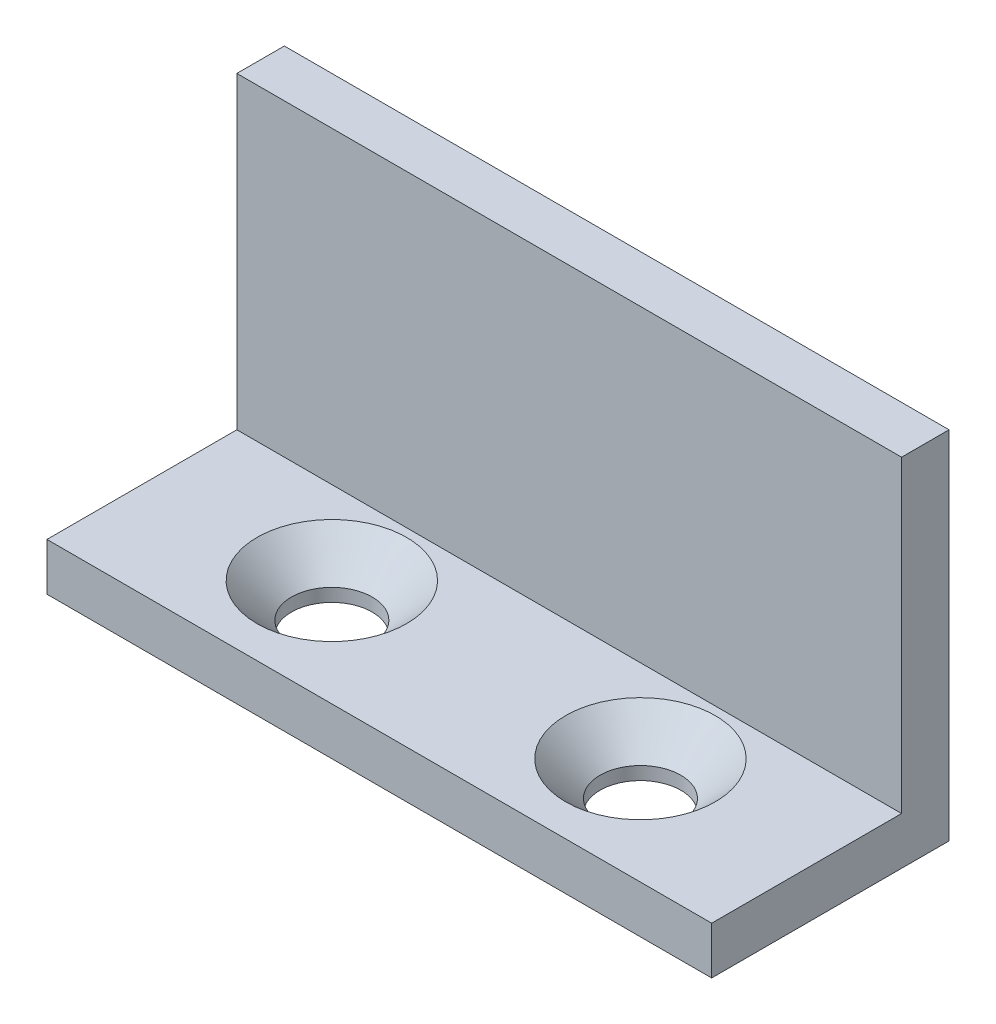
ISO-10303-21;
HEADER;
FILE_DESCRIPTION(('STEP AP214'),'2;1');
FILE_NAME('part.step','',(''),(''),'','','');
FILE_SCHEMA(('AUTOMOTIVE_DESIGN { 1 0 10303 214 1 1 1 1 }'));
ENDSEC;
DATA;
#1=APPLICATION_CONTEXT('core data for automotive mechanical design processes');
#2=APPLICATION_PROTOCOL_DEFINITION('international standard','automotive_design',2000,#1);
#3=PRODUCT_CONTEXT('',#1,'mechanical');
#4=PRODUCT('Part','Part','',(#3));
#5=PRODUCT_RELATED_PRODUCT_CATEGORY('part','',(#4));
#6=PRODUCT_DEFINITION_FORMATION('','',#4);
#7=PRODUCT_DEFINITION_CONTEXT('part definition',#1,'design');
#8=PRODUCT_DEFINITION('design','',#6,#7);
#9=PRODUCT_DEFINITION_SHAPE('','',#8);
#10=(LENGTH_UNIT() NAMED_UNIT(*) SI_UNIT(.MILLI.,.METRE.));
#11=(NAMED_UNIT(*) PLANE_ANGLE_UNIT() SI_UNIT($,.RADIAN.));
#12=(NAMED_UNIT(*) SI_UNIT($,.STERADIAN.) SOLID_ANGLE_UNIT());
#13=UNCERTAINTY_MEASURE_WITH_UNIT(LENGTH_MEASURE(1.E-05),#10,'distance_accuracy_value','');
#14=(GEOMETRIC_REPRESENTATION_CONTEXT(3) GLOBAL_UNCERTAINTY_ASSIGNED_CONTEXT((#13)) GLOBAL_UNIT_ASSIGNED_CONTEXT((#10,
#11,#12)) REPRESENTATION_CONTEXT('',''));
#15=CARTESIAN_POINT('',(0.,0.,0.));
#16=DIRECTION('',(0.,0.,1.));
#17=DIRECTION('',(1.,0.,0.));
#18=AXIS2_PLACEMENT_3D('',#15,#16,#17);
#19=CARTESIAN_POINT('',(28.,2.,10.));
#20=DIRECTION('',(0.,0.,-1.));
#21=DIRECTION('',(-1.,0.,0.));
#22=AXIS2_PLACEMENT_3D('',#19,#20,#21);
#23=PLANE('',#22);
#24=DIRECTION('',(0.,-1.,0.));
#25=VECTOR('',#24,1.);
#26=CARTESIAN_POINT('',(0.,2.,10.));
#27=LINE('',#26,#25);
#28=CARTESIAN_POINT('',(0.,2.,10.));
#29=VERTEX_POINT('',#28);
#30=CARTESIAN_POINT('',(0.,0.,10.));
#31=VERTEX_POINT('',#30);
#32=EDGE_CURVE('E120',#29,#31,#27,.T.);
#33=ORIENTED_EDGE('',*,*,#32,.T.);
#34=DIRECTION('',(-1.,0.,0.));
#35=VECTOR('',#34,1.);
#36=CARTESIAN_POINT('',(28.,0.,10.));
#37=LINE('',#36,#35);
#38=CARTESIAN_POINT('',(28.,0.,10.));
#39=VERTEX_POINT('',#38);
#40=EDGE_CURVE('E11',#39,#31,#37,.T.);
#41=ORIENTED_EDGE('',*,*,#40,.F.);
#42=DIRECTION('',(0.,-1.,0.));
#43=VECTOR('',#42,1.);
#44=CARTESIAN_POINT('',(28.,2.,10.));
#45=LINE('',#44,#43);
#46=CARTESIAN_POINT('',(28.,2.,10.));
#47=VERTEX_POINT('',#46);
#48=EDGE_CURVE('E131',#47,#39,#45,.T.);
#49=ORIENTED_EDGE('',*,*,#48,.F.);
#50=DIRECTION('',(-1.,0.,0.));
#51=VECTOR('',#50,1.);
#52=CARTESIAN_POINT('',(28.,2.,10.));
#53=LINE('',#52,#51);
#54=EDGE_CURVE('E116',#47,#29,#53,.T.);
#55=ORIENTED_EDGE('',*,*,#54,.T.);
#56=EDGE_LOOP('',(#33,#41,#49,#55));
#57=FACE_BOUND('',#56,.T.);
#58=ADVANCED_FACE('F36',(#57),#23,.F.);
#59=CARTESIAN_POINT('',(28.,0.,10.));
#60=DIRECTION('',(0.,1.,0.));
#61=DIRECTION('',(0.,0.,1.));
#62=AXIS2_PLACEMENT_3D('',#59,#60,#61);
#63=PLANE('',#62);
#64=CARTESIAN_POINT('',(7.5,0.,5.5));
#65=DIRECTION('',(0.,1.,0.));
#66=DIRECTION('',(0.,0.,1.));
#67=AXIS2_PLACEMENT_3D('',#64,#65,#66);
#68=CIRCLE('',#67,1.7);
#69=CARTESIAN_POINT('',(7.5,0.,7.2));
#70=VERTEX_POINT('',#69);
#71=EDGE_CURVE('E253',#70,#70,#68,.T.);
#72=ORIENTED_EDGE('',*,*,#71,.T.);
#73=EDGE_LOOP('',(#72));
#74=FACE_BOUND('',#73,.T.);
#75=CARTESIAN_POINT('',(20.5,0.,5.5));
#76=DIRECTION('',(0.,1.,0.));
#77=DIRECTION('',(0.,0.,1.));
#78=AXIS2_PLACEMENT_3D('',#75,#76,#77);
#79=CIRCLE('',#78,1.7);
#80=CARTESIAN_POINT('',(20.5,0.,7.2));
#81=VERTEX_POINT('',#80);
#82=EDGE_CURVE('E124',#81,#81,#79,.T.);
#83=ORIENTED_EDGE('',*,*,#82,.T.);
#84=EDGE_LOOP('',(#83));
#85=FACE_BOUND('',#84,.T.);
#86=DIRECTION('',(0.,0.,-1.));
#87=VECTOR('',#86,1.);
#88=CARTESIAN_POINT('',(0.,0.,10.));
#89=LINE('',#88,#87);
#90=CARTESIAN_POINT('',(0.,0.,0.));
#91=VERTEX_POINT('',#90);
#92=EDGE_CURVE('E123',#31,#91,#89,.T.);
#93=ORIENTED_EDGE('',*,*,#92,.T.);
#94=DIRECTION('',(-1.,0.,0.));
#95=VECTOR('',#94,1.);
#96=CARTESIAN_POINT('',(28.,0.,0.));
#97=LINE('',#96,#95);
#98=CARTESIAN_POINT('',(28.,0.,0.));
#99=VERTEX_POINT('',#98);
#100=EDGE_CURVE('E44',#99,#91,#97,.T.);
#101=ORIENTED_EDGE('',*,*,#100,.F.);
#102=DIRECTION('',(0.,0.,-1.));
#103=VECTOR('',#102,1.);
#104=CARTESIAN_POINT('',(28.,0.,10.));
#105=LINE('',#104,#103);
#106=EDGE_CURVE('E89',#39,#99,#105,.T.);
#107=ORIENTED_EDGE('',*,*,#106,.F.);
#108=ORIENTED_EDGE('',*,*,#40,.T.);
#109=EDGE_LOOP('',(#93,#101,#107,#108));
#110=FACE_BOUND('',#109,.T.);
#111=ADVANCED_FACE('F158',(#74,#85,#110),#63,.F.);
#112=CARTESIAN_POINT('',(28.,0.,0.));
#113=DIRECTION('',(0.,0.,1.));
#114=DIRECTION('',(1.,0.,0.));
#115=AXIS2_PLACEMENT_3D('',#112,#113,#114);
#116=PLANE('',#115);
#117=DIRECTION('',(0.,1.,0.));
#118=VECTOR('',#117,1.);
#119=CARTESIAN_POINT('',(0.,0.,0.));
#120=LINE('',#119,#118);
#121=CARTESIAN_POINT('',(0.,15.,0.));
#122=VERTEX_POINT('',#121);
#123=EDGE_CURVE('E126',#91,#122,#120,.T.);
#124=ORIENTED_EDGE('',*,*,#123,.T.);
#125=DIRECTION('',(-1.,0.,0.));
#126=VECTOR('',#125,1.);
#127=CARTESIAN_POINT('',(28.,15.,0.));
#128=LINE('',#127,#126);
#129=CARTESIAN_POINT('',(28.,15.,0.));
#130=VERTEX_POINT('',#129);
#131=EDGE_CURVE('E111',#130,#122,#128,.T.);
#132=ORIENTED_EDGE('',*,*,#131,.F.);
#133=DIRECTION('',(0.,1.,0.));
#134=VECTOR('',#133,1.);
#135=CARTESIAN_POINT('',(28.,0.,0.));
#136=LINE('',#135,#134);
#137=EDGE_CURVE('E102',#99,#130,#136,.T.);
#138=ORIENTED_EDGE('',*,*,#137,.F.);
#139=ORIENTED_EDGE('',*,*,#100,.T.);
#140=EDGE_LOOP('',(#124,#132,#138,#139));
#141=FACE_BOUND('',#140,.T.);
#142=ADVANCED_FACE('F137',(#141),#116,.F.);
#143=CARTESIAN_POINT('',(28.,15.,2.));
#144=DIRECTION('',(0.,-1.,0.));
#145=DIRECTION('',(0.,0.,-1.));
#146=AXIS2_PLACEMENT_3D('',#143,#144,#145);
#147=PLANE('',#146);
#148=DIRECTION('',(0.,0.,1.));
#149=VECTOR('',#148,1.);
#150=CARTESIAN_POINT('',(0.,15.,2.));
#151=LINE('',#150,#149);
#152=CARTESIAN_POINT('',(0.,15.,2.));
#153=VERTEX_POINT('',#152);
#154=EDGE_CURVE('E110',#122,#153,#151,.T.);
#155=ORIENTED_EDGE('',*,*,#154,.T.);
#156=DIRECTION('',(-1.,0.,0.));
#157=VECTOR('',#156,1.);
#158=CARTESIAN_POINT('',(28.,15.,2.));
#159=LINE('',#158,#157);
#160=CARTESIAN_POINT('',(28.,15.,2.));
#161=VERTEX_POINT('',#160);
#162=EDGE_CURVE('E107',#161,#153,#159,.T.);
#163=ORIENTED_EDGE('',*,*,#162,.F.);
#164=DIRECTION('',(0.,0.,1.));
#165=VECTOR('',#164,1.);
#166=CARTESIAN_POINT('',(28.,15.,2.));
#167=LINE('',#166,#165);
#168=EDGE_CURVE('E96',#130,#161,#167,.T.);
#169=ORIENTED_EDGE('',*,*,#168,.F.);
#170=ORIENTED_EDGE('',*,*,#131,.T.);
#171=EDGE_LOOP('',(#155,#163,#169,#170));
#172=FACE_BOUND('',#171,.T.);
#173=ADVANCED_FACE('F108',(#172),#147,.F.);
#174=CARTESIAN_POINT('',(28.,2.,2.));
#175=DIRECTION('',(0.,0.,-1.));
#176=DIRECTION('',(-1.,0.,0.));
#177=AXIS2_PLACEMENT_3D('',#174,#175,#176);
#178=PLANE('',#177);
#179=DIRECTION('',(0.,-1.,0.));
#180=VECTOR('',#179,1.);
#181=CARTESIAN_POINT('',(0.,2.,2.));
#182=LINE('',#181,#180);
#183=CARTESIAN_POINT('',(0.,2.,2.));
#184=VERTEX_POINT('',#183);
#185=EDGE_CURVE('E75',#153,#184,#182,.T.);
#186=ORIENTED_EDGE('',*,*,#185,.T.);
#187=DIRECTION('',(-1.,0.,0.));
#188=VECTOR('',#187,1.);
#189=CARTESIAN_POINT('',(28.,2.,2.));
#190=LINE('',#189,#188);
#191=CARTESIAN_POINT('',(28.,2.,2.));
#192=VERTEX_POINT('',#191);
#193=EDGE_CURVE('E112',#192,#184,#190,.T.);
#194=ORIENTED_EDGE('',*,*,#193,.F.);
#195=DIRECTION('',(0.,-1.,0.));
#196=VECTOR('',#195,1.);
#197=CARTESIAN_POINT('',(28.,2.,2.));
#198=LINE('',#197,#196);
#199=EDGE_CURVE('E100',#161,#192,#198,.T.);
#200=ORIENTED_EDGE('',*,*,#199,.F.);
#201=ORIENTED_EDGE('',*,*,#162,.T.);
#202=EDGE_LOOP('',(#186,#194,#200,#201));
#203=FACE_BOUND('',#202,.T.);
#204=ADVANCED_FACE('F114',(#203),#178,.F.);
#205=CARTESIAN_POINT('',(28.,2.,10.));
#206=DIRECTION('',(0.,-1.,0.));
#207=DIRECTION('',(0.,0.,-1.));
#208=AXIS2_PLACEMENT_3D('',#205,#206,#207);
#209=PLANE('',#208);
#210=CARTESIAN_POINT('',(7.5,2.,5.5));
#211=DIRECTION('',(0.,1.,0.));
#212=DIRECTION('',(0.,0.,1.));
#213=AXIS2_PLACEMENT_3D('',#210,#211,#212);
#214=CIRCLE('',#213,3.15);
#215=CARTESIAN_POINT('',(7.5,2.,8.65));
#216=VERTEX_POINT('',#215);
#217=EDGE_CURVE('E251',#216,#216,#214,.T.);
#218=ORIENTED_EDGE('',*,*,#217,.F.);
#219=EDGE_LOOP('',(#218));
#220=FACE_BOUND('',#219,.T.);
#221=CARTESIAN_POINT('',(20.5,2.,5.5));
#222=DIRECTION('',(0.,1.,0.));
#223=DIRECTION('',(0.,0.,1.));
#224=AXIS2_PLACEMENT_3D('',#221,#222,#223);
#225=CIRCLE('',#224,3.15);
#226=CARTESIAN_POINT('',(20.5,2.,8.65));
#227=VERTEX_POINT('',#226);
#228=EDGE_CURVE('E257',#227,#227,#225,.T.);
#229=ORIENTED_EDGE('',*,*,#228,.F.);
#230=EDGE_LOOP('',(#229));
#231=FACE_BOUND('',#230,.T.);
#232=DIRECTION('',(0.,0.,1.));
#233=VECTOR('',#232,1.);
#234=CARTESIAN_POINT('',(0.,2.,10.));
#235=LINE('',#234,#233);
#236=EDGE_CURVE('E81',#184,#29,#235,.T.);
#237=ORIENTED_EDGE('',*,*,#236,.T.);
#238=ORIENTED_EDGE('',*,*,#54,.F.);
#239=DIRECTION('',(0.,0.,1.));
#240=VECTOR('',#239,1.);
#241=CARTESIAN_POINT('',(28.,2.,10.));
#242=LINE('',#241,#240);
#243=EDGE_CURVE('E52',#192,#47,#242,.T.);
#244=ORIENTED_EDGE('',*,*,#243,.F.);
#245=ORIENTED_EDGE('',*,*,#193,.T.);
#246=EDGE_LOOP('',(#237,#238,#244,#245));
#247=FACE_BOUND('',#246,.T.);
#248=ADVANCED_FACE('F144',(#220,#231,#247),#209,.F.);
#249=CARTESIAN_POINT('',(28.,0.,0.));
#250=DIRECTION('',(1.,0.,0.));
#251=DIRECTION('',(0.,0.,-1.));
#252=AXIS2_PLACEMENT_3D('',#249,#250,#251);
#253=PLANE('',#252);
#254=ORIENTED_EDGE('',*,*,#48,.T.);
#255=ORIENTED_EDGE('',*,*,#106,.T.);
#256=ORIENTED_EDGE('',*,*,#137,.T.);
#257=ORIENTED_EDGE('',*,*,#168,.T.);
#258=ORIENTED_EDGE('',*,*,#199,.T.);
#259=ORIENTED_EDGE('',*,*,#243,.T.);
#260=EDGE_LOOP('',(#254,#255,#256,#257,#258,#259));
#261=FACE_BOUND('',#260,.T.);
#262=ADVANCED_FACE('F98',(#261),#253,.T.);
#263=CARTESIAN_POINT('',(0.,0.,0.));
#264=DIRECTION('',(1.,0.,0.));
#265=DIRECTION('',(0.,0.,-1.));
#266=AXIS2_PLACEMENT_3D('',#263,#264,#265);
#267=PLANE('',#266);
#268=ORIENTED_EDGE('',*,*,#32,.F.);
#269=ORIENTED_EDGE('',*,*,#236,.F.);
#270=ORIENTED_EDGE('',*,*,#185,.F.);
#271=ORIENTED_EDGE('',*,*,#154,.F.);
#272=ORIENTED_EDGE('',*,*,#123,.F.);
#273=ORIENTED_EDGE('',*,*,#92,.F.);
#274=EDGE_LOOP('',(#268,#269,#270,#271,#272,#273));
#275=FACE_BOUND('',#274,.T.);
#276=ADVANCED_FACE('F140',(#275),#267,.F.);
#277=CARTESIAN_POINT('',(20.5,2.,5.5));
#278=DIRECTION('',(0.,1.,0.));
#279=DIRECTION('',(0.,0.,1.));
#280=AXIS2_PLACEMENT_3D('',#277,#278,#279);
#281=CYLINDRICAL_SURFACE('',#280,1.69999999999999);
#282=ORIENTED_EDGE('',*,*,#82,.F.);
#283=EDGE_LOOP('',(#282));
#284=FACE_BOUND('',#283,.T.);
#285=CARTESIAN_POINT('',(20.5,0.549999999999993,5.5));
#286=DIRECTION('',(0.,1.,0.));
#287=DIRECTION('',(0.,0.,1.));
#288=AXIS2_PLACEMENT_3D('',#285,#286,#287);
#289=CIRCLE('',#288,1.69999999999999);
#290=CARTESIAN_POINT('',(20.5,0.549999999999993,7.19999999999999));
#291=VERTEX_POINT('',#290);
#292=EDGE_CURVE('E260',#291,#291,#289,.T.);
#293=ORIENTED_EDGE('',*,*,#292,.T.);
#294=EDGE_LOOP('',(#293));
#295=FACE_BOUND('',#294,.T.);
#296=ADVANCED_FACE('F194',(#284,#295),#281,.F.);
#297=CARTESIAN_POINT('',(20.5,2.,5.5));
#298=DIRECTION('',(0.,1.,0.));
#299=DIRECTION('',(0.,0.,1.));
#300=AXIS2_PLACEMENT_3D('',#297,#298,#299);
#301=CONICAL_SURFACE('',#300,3.15,0.78539816339745);
#302=ORIENTED_EDGE('',*,*,#292,.F.);
#303=EDGE_LOOP('',(#302));
#304=FACE_BOUND('',#303,.T.);
#305=ORIENTED_EDGE('',*,*,#228,.T.);
#306=EDGE_LOOP('',(#305));
#307=FACE_BOUND('',#306,.T.);
#308=ADVANCED_FACE('F212',(#304,#307),#301,.F.);
#309=CARTESIAN_POINT('',(7.5,2.,5.5));
#310=DIRECTION('',(0.,1.,0.));
#311=DIRECTION('',(0.,0.,1.));
#312=AXIS2_PLACEMENT_3D('',#309,#310,#311);
#313=CYLINDRICAL_SURFACE('',#312,1.69999999999999);
#314=ORIENTED_EDGE('',*,*,#71,.F.);
#315=EDGE_LOOP('',(#314));
#316=FACE_BOUND('',#315,.T.);
#317=CARTESIAN_POINT('',(7.5,0.549999999999993,5.5));
#318=DIRECTION('',(0.,1.,0.));
#319=DIRECTION('',(0.,0.,1.));
#320=AXIS2_PLACEMENT_3D('',#317,#318,#319);
#321=CIRCLE('',#320,1.69999999999999);
#322=CARTESIAN_POINT('',(7.5,0.549999999999993,7.19999999999999));
#323=VERTEX_POINT('',#322);
#324=EDGE_CURVE('E249',#323,#323,#321,.T.);
#325=ORIENTED_EDGE('',*,*,#324,.T.);
#326=EDGE_LOOP('',(#325));
#327=FACE_BOUND('',#326,.T.);
#328=ADVANCED_FACE('F222',(#316,#327),#313,.F.);
#329=CARTESIAN_POINT('',(7.5,2.,5.5));
#330=DIRECTION('',(0.,1.,0.));
#331=DIRECTION('',(0.,0.,1.));
#332=AXIS2_PLACEMENT_3D('',#329,#330,#331);
#333=CONICAL_SURFACE('',#332,3.15,0.78539816339745);
#334=ORIENTED_EDGE('',*,*,#324,.F.);
#335=EDGE_LOOP('',(#334));
#336=FACE_BOUND('',#335,.T.);
#337=ORIENTED_EDGE('',*,*,#217,.T.);
#338=EDGE_LOOP('',(#337));
#339=FACE_BOUND('',#338,.T.);
#340=ADVANCED_FACE('F232',(#336,#339),#333,.F.);
#341=CLOSED_SHELL('',(#58,#111,#142,#173,#204,#248,#262,#276,#296,#308,#328,#340));
#342=MANIFOLD_SOLID_BREP('B2',#341);
#343=ADVANCED_BREP_SHAPE_REPRESENTATION('',(#18,#342),#14);
#344=SHAPE_DEFINITION_REPRESENTATION(#9,#343);
ENDSEC;
END-ISO-10303-21;
